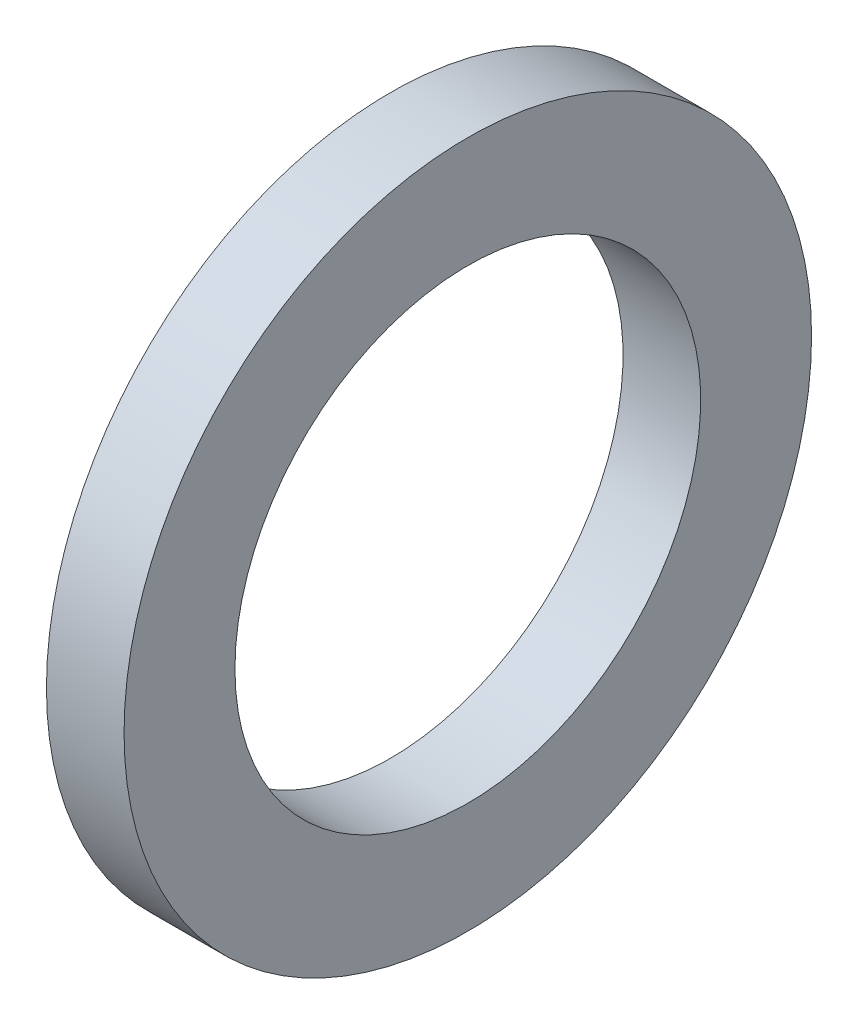
ISO-10303-21;
HEADER;
FILE_DESCRIPTION(('STEP AP214'),'2;1');
FILE_NAME('part.step','',(''),(''),'','','');
FILE_SCHEMA(('AUTOMOTIVE_DESIGN { 1 0 10303 214 1 1 1 1 }'));
ENDSEC;
DATA;
#1=APPLICATION_CONTEXT('core data for automotive mechanical design processes');
#2=APPLICATION_PROTOCOL_DEFINITION('international standard','automotive_design',2000,#1);
#3=PRODUCT_CONTEXT('',#1,'mechanical');
#4=PRODUCT('Part','Part','',(#3));
#5=PRODUCT_RELATED_PRODUCT_CATEGORY('part','',(#4));
#6=PRODUCT_DEFINITION_FORMATION('','',#4);
#7=PRODUCT_DEFINITION_CONTEXT('part definition',#1,'design');
#8=PRODUCT_DEFINITION('design','',#6,#7);
#9=PRODUCT_DEFINITION_SHAPE('','',#8);
#10=(LENGTH_UNIT() NAMED_UNIT(*) SI_UNIT(.MILLI.,.METRE.));
#11=(NAMED_UNIT(*) PLANE_ANGLE_UNIT() SI_UNIT($,.RADIAN.));
#12=(NAMED_UNIT(*) SI_UNIT($,.STERADIAN.) SOLID_ANGLE_UNIT());
#13=UNCERTAINTY_MEASURE_WITH_UNIT(LENGTH_MEASURE(1.E-05),#10,'distance_accuracy_value','');
#14=(GEOMETRIC_REPRESENTATION_CONTEXT(3) GLOBAL_UNCERTAINTY_ASSIGNED_CONTEXT((#13)) GLOBAL_UNIT_ASSIGNED_CONTEXT((#10,
#11,#12)) REPRESENTATION_CONTEXT('',''));
#15=CARTESIAN_POINT('',(0.,0.,0.));
#16=DIRECTION('',(0.,0.,1.));
#17=DIRECTION('',(1.,0.,0.));
#18=AXIS2_PLACEMENT_3D('',#15,#16,#17);
#19=CARTESIAN_POINT('',(-34.9249999999999,0.,0.));
#20=DIRECTION('',(-1.,0.,0.));
#21=DIRECTION('',(0.,0.,1.));
#22=AXIS2_PLACEMENT_3D('',#19,#20,#21);
#23=CYLINDRICAL_SURFACE('',#22,10.5);
#24=CARTESIAN_POINT('',(0.,0.,0.));
#25=DIRECTION('',(-1.,0.,0.));
#26=DIRECTION('',(0.,0.,1.));
#27=AXIS2_PLACEMENT_3D('',#24,#25,#26);
#28=CIRCLE('',#27,10.5);
#29=CARTESIAN_POINT('',(0.,0.,10.5));
#30=VERTEX_POINT('',#29);
#31=EDGE_CURVE('E10',#30,#30,#28,.T.);
#32=ORIENTED_EDGE('',*,*,#31,.F.);
#33=EDGE_LOOP('',(#32));
#34=FACE_BOUND('',#33,.T.);
#35=CARTESIAN_POINT('',(-3.5,0.,0.));
#36=DIRECTION('',(-1.,0.,0.));
#37=DIRECTION('',(0.,0.,1.));
#38=AXIS2_PLACEMENT_3D('',#35,#36,#37);
#39=CIRCLE('',#38,10.5);
#40=CARTESIAN_POINT('',(-3.5,0.,10.5));
#41=VERTEX_POINT('',#40);
#42=EDGE_CURVE('E44',#41,#41,#39,.T.);
#43=ORIENTED_EDGE('',*,*,#42,.T.);
#44=EDGE_LOOP('',(#43));
#45=FACE_BOUND('',#44,.T.);
#46=ADVANCED_FACE('F30',(#34,#45),#23,.F.);
#47=CARTESIAN_POINT('',(0.,10.5,0.));
#48=DIRECTION('',(-1.,0.,0.));
#49=DIRECTION('',(0.,0.,1.));
#50=AXIS2_PLACEMENT_3D('',#47,#48,#49);
#51=PLANE('',#50);
#52=CARTESIAN_POINT('',(0.,0.,0.));
#53=DIRECTION('',(-1.,0.,0.));
#54=DIRECTION('',(0.,0.,1.));
#55=AXIS2_PLACEMENT_3D('',#52,#53,#54);
#56=CIRCLE('',#55,15.5);
#57=CARTESIAN_POINT('',(0.,0.,15.5));
#58=VERTEX_POINT('',#57);
#59=EDGE_CURVE('E36',#58,#58,#56,.T.);
#60=ORIENTED_EDGE('',*,*,#59,.F.);
#61=EDGE_LOOP('',(#60));
#62=FACE_BOUND('',#61,.T.);
#63=ORIENTED_EDGE('',*,*,#31,.T.);
#64=EDGE_LOOP('',(#63));
#65=FACE_BOUND('',#64,.T.);
#66=ADVANCED_FACE('F59',(#62,#65),#51,.F.);
#67=CARTESIAN_POINT('',(-34.9249999999999,0.,0.));
#68=DIRECTION('',(-1.,0.,0.));
#69=DIRECTION('',(0.,0.,1.));
#70=AXIS2_PLACEMENT_3D('',#67,#68,#69);
#71=CYLINDRICAL_SURFACE('',#70,15.5);
#72=CARTESIAN_POINT('',(-3.5,0.,0.));
#73=DIRECTION('',(-1.,0.,0.));
#74=DIRECTION('',(0.,0.,1.));
#75=AXIS2_PLACEMENT_3D('',#72,#73,#74);
#76=CIRCLE('',#75,15.5);
#77=CARTESIAN_POINT('',(-3.5,0.,15.5));
#78=VERTEX_POINT('',#77);
#79=EDGE_CURVE('E40',#78,#78,#76,.T.);
#80=ORIENTED_EDGE('',*,*,#79,.F.);
#81=EDGE_LOOP('',(#80));
#82=FACE_BOUND('',#81,.T.);
#83=ORIENTED_EDGE('',*,*,#59,.T.);
#84=EDGE_LOOP('',(#83));
#85=FACE_BOUND('',#84,.T.);
#86=ADVANCED_FACE('F54',(#82,#85),#71,.T.);
#87=CARTESIAN_POINT('',(-3.5,15.5,0.));
#88=DIRECTION('',(1.,0.,0.));
#89=DIRECTION('',(0.,0.,-1.));
#90=AXIS2_PLACEMENT_3D('',#87,#88,#89);
#91=PLANE('',#90);
#92=ORIENTED_EDGE('',*,*,#42,.F.);
#93=EDGE_LOOP('',(#92));
#94=FACE_BOUND('',#93,.T.);
#95=ORIENTED_EDGE('',*,*,#79,.T.);
#96=EDGE_LOOP('',(#95));
#97=FACE_BOUND('',#96,.T.);
#98=ADVANCED_FACE('F51',(#94,#97),#91,.F.);
#99=CLOSED_SHELL('',(#46,#66,#86,#98));
#100=MANIFOLD_SOLID_BREP('B2',#99);
#101=ADVANCED_BREP_SHAPE_REPRESENTATION('',(#18,#100),#14);
#102=SHAPE_DEFINITION_REPRESENTATION(#9,#101);
ENDSEC;
END-ISO-10303-21;
